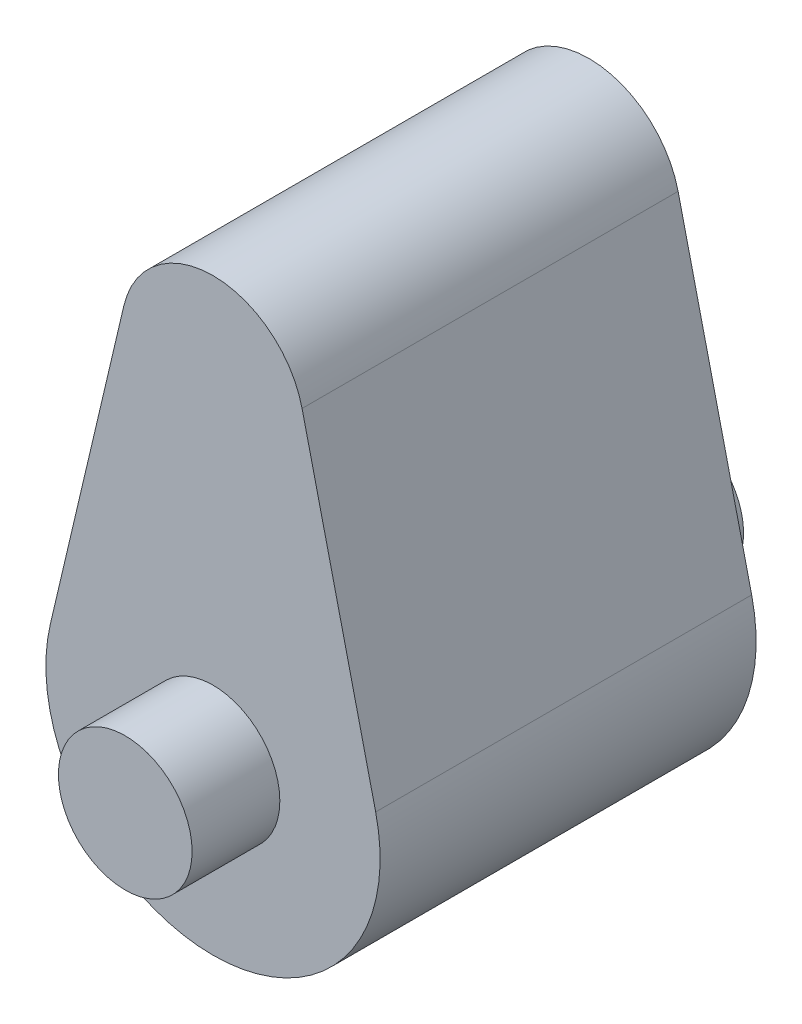
ISO-10303-21;
HEADER;
FILE_DESCRIPTION(('STEP AP214'),'2;1');
FILE_NAME('part.step','',(''),(''),'','','');
FILE_SCHEMA(('AUTOMOTIVE_DESIGN { 1 0 10303 214 1 1 1 1 }'));
ENDSEC;
DATA;
#1=APPLICATION_CONTEXT('core data for automotive mechanical design processes');
#2=APPLICATION_PROTOCOL_DEFINITION('international standard','automotive_design',2000,#1);
#3=PRODUCT_CONTEXT('',#1,'mechanical');
#4=PRODUCT('Part','Part','',(#3));
#5=PRODUCT_RELATED_PRODUCT_CATEGORY('part','',(#4));
#6=PRODUCT_DEFINITION_FORMATION('','',#4);
#7=PRODUCT_DEFINITION_CONTEXT('part definition',#1,'design');
#8=PRODUCT_DEFINITION('design','',#6,#7);
#9=PRODUCT_DEFINITION_SHAPE('','',#8);
#10=(LENGTH_UNIT() NAMED_UNIT(*) SI_UNIT(.MILLI.,.METRE.));
#11=(NAMED_UNIT(*) PLANE_ANGLE_UNIT() SI_UNIT($,.RADIAN.));
#12=(NAMED_UNIT(*) SI_UNIT($,.STERADIAN.) SOLID_ANGLE_UNIT());
#13=UNCERTAINTY_MEASURE_WITH_UNIT(LENGTH_MEASURE(1.E-05),#10,'distance_accuracy_value','');
#14=(GEOMETRIC_REPRESENTATION_CONTEXT(3) GLOBAL_UNCERTAINTY_ASSIGNED_CONTEXT((#13)) GLOBAL_UNIT_ASSIGNED_CONTEXT((#10,
#11,#12)) REPRESENTATION_CONTEXT('',''));
#15=CARTESIAN_POINT('',(0.,0.,0.));
#16=DIRECTION('',(0.,0.,1.));
#17=DIRECTION('',(1.,0.,0.));
#18=AXIS2_PLACEMENT_3D('',#15,#16,#17);
#19=CARTESIAN_POINT('',(0.,0.,66.));
#20=DIRECTION('',(0.,0.,-1.));
#21=DIRECTION('',(-1.,0.,0.));
#22=AXIS2_PLACEMENT_3D('',#19,#20,#21);
#23=CYLINDRICAL_SURFACE('',#22,8.);
#24=CARTESIAN_POINT('',(0.,0.,55.5));
#25=DIRECTION('',(0.,0.,1.));
#26=DIRECTION('',(1.,0.,0.));
#27=AXIS2_PLACEMENT_3D('',#24,#25,#26);
#28=CIRCLE('',#27,8.);
#29=CARTESIAN_POINT('',(8.,0.,55.5));
#30=VERTEX_POINT('',#29);
#31=EDGE_CURVE('E36',#30,#30,#28,.T.);
#32=ORIENTED_EDGE('',*,*,#31,.T.);
#33=EDGE_LOOP('',(#32));
#34=FACE_BOUND('',#33,.T.);
#35=CARTESIAN_POINT('',(0.,0.,66.));
#36=DIRECTION('',(0.,0.,1.));
#37=DIRECTION('',(1.,0.,0.));
#38=AXIS2_PLACEMENT_3D('',#35,#36,#37);
#39=CIRCLE('',#38,8.);
#40=CARTESIAN_POINT('',(8.,0.,66.));
#41=VERTEX_POINT('',#40);
#42=EDGE_CURVE('E42',#41,#41,#39,.T.);
#43=ORIENTED_EDGE('',*,*,#42,.F.);
#44=EDGE_LOOP('',(#43));
#45=FACE_BOUND('',#44,.T.);
#46=ADVANCED_FACE('F33',(#34,#45),#23,.T.);
#47=CARTESIAN_POINT('',(0.,0.,66.));
#48=DIRECTION('',(0.,0.,1.));
#49=DIRECTION('',(1.,0.,0.));
#50=AXIS2_PLACEMENT_3D('',#47,#48,#49);
#51=PLANE('',#50);
#52=ORIENTED_EDGE('',*,*,#42,.T.);
#53=EDGE_LOOP('',(#52));
#54=FACE_BOUND('',#53,.T.);
#55=ADVANCED_FACE('F134',(#54),#51,.T.);
#56=CARTESIAN_POINT('',(0.,39.4931817263597,55.5));
#57=DIRECTION('',(0.,0.,-1.));
#58=DIRECTION('',(-1.,0.,0.));
#59=AXIS2_PLACEMENT_3D('',#56,#57,#58);
#60=CYLINDRICAL_SURFACE('',#59,10.9534248239518);
#61=CARTESIAN_POINT('',(0.,39.4931817263597,10.5));
#62=DIRECTION('',(0.,0.,1.));
#63=DIRECTION('',(1.,0.,0.));
#64=AXIS2_PLACEMENT_3D('',#61,#62,#63);
#65=CIRCLE('',#64,10.9534248239518);
#66=CARTESIAN_POINT('',(10.6621810863964,42.0022472605487,10.5));
#67=VERTEX_POINT('',#66);
#68=CARTESIAN_POINT('',(-10.6621810863964,42.0022472605487,10.5));
#69=VERTEX_POINT('',#68);
#70=EDGE_CURVE('E101',#67,#69,#65,.T.);
#71=ORIENTED_EDGE('',*,*,#70,.T.);
#72=DIRECTION('',(0.,0.,-1.));
#73=VECTOR('',#72,1.);
#74=CARTESIAN_POINT('',(-10.6621810863964,42.0022472605487,55.5));
#75=LINE('',#74,#73);
#76=CARTESIAN_POINT('',(-10.6621810863964,42.0022472605487,55.5));
#77=VERTEX_POINT('',#76);
#78=EDGE_CURVE('E92',#77,#69,#75,.T.);
#79=ORIENTED_EDGE('',*,*,#78,.F.);
#80=CARTESIAN_POINT('',(0.,39.4931817263597,55.5));
#81=DIRECTION('',(0.,0.,1.));
#82=DIRECTION('',(1.,0.,0.));
#83=AXIS2_PLACEMENT_3D('',#80,#81,#82);
#84=CIRCLE('',#83,10.9534248239518);
#85=CARTESIAN_POINT('',(10.6621810863964,42.0022472605487,55.5));
#86=VERTEX_POINT('',#85);
#87=EDGE_CURVE('E86',#86,#77,#84,.T.);
#88=ORIENTED_EDGE('',*,*,#87,.F.);
#89=DIRECTION('',(0.,0.,-1.));
#90=VECTOR('',#89,1.);
#91=CARTESIAN_POINT('',(10.6621810863964,42.0022472605487,55.5));
#92=LINE('',#91,#90);
#93=EDGE_CURVE('E97',#86,#67,#92,.T.);
#94=ORIENTED_EDGE('',*,*,#93,.T.);
#95=EDGE_LOOP('',(#71,#79,#88,#94));
#96=FACE_BOUND('',#95,.T.);
#97=ADVANCED_FACE('F141',(#96),#60,.T.);
#98=CARTESIAN_POINT('',(-10.6621810863964,42.0022472605487,55.5));
#99=DIRECTION('',(0.973410714709195,-0.229066759896178,0.));
#100=DIRECTION('',(0.229066759896178,0.973410714709196,0.));
#101=AXIS2_PLACEMENT_3D('',#98,#99,#100);
#102=PLANE('',#101);
#103=DIRECTION('',(-0.229066759896178,-0.973410714709196,0.));
#104=VECTOR('',#103,1.);
#105=CARTESIAN_POINT('',(-10.6621810863964,42.0022472605487,10.5));
#106=LINE('',#105,#104);
#107=CARTESIAN_POINT('',(-19.4682142941839,4.58133519792355,10.5));
#108=VERTEX_POINT('',#107);
#109=EDGE_CURVE('E91',#69,#108,#106,.T.);
#110=ORIENTED_EDGE('',*,*,#109,.T.);
#111=DIRECTION('',(0.,0.,-1.));
#112=VECTOR('',#111,1.);
#113=CARTESIAN_POINT('',(-19.4682142941839,4.58133519792355,55.5));
#114=LINE('',#113,#112);
#115=CARTESIAN_POINT('',(-19.4682142941839,4.58133519792355,55.5));
#116=VERTEX_POINT('',#115);
#117=EDGE_CURVE('E89',#116,#108,#114,.T.);
#118=ORIENTED_EDGE('',*,*,#117,.F.);
#119=DIRECTION('',(-0.229066759896178,-0.973410714709196,0.));
#120=VECTOR('',#119,1.);
#121=CARTESIAN_POINT('',(-10.6621810863964,42.0022472605487,55.5));
#122=LINE('',#121,#120);
#123=EDGE_CURVE('E81',#77,#116,#122,.T.);
#124=ORIENTED_EDGE('',*,*,#123,.F.);
#125=ORIENTED_EDGE('',*,*,#78,.T.);
#126=EDGE_LOOP('',(#110,#118,#124,#125));
#127=FACE_BOUND('',#126,.T.);
#128=ADVANCED_FACE('F90',(#127),#102,.F.);
#129=CARTESIAN_POINT('',(0.,0.,55.5));
#130=DIRECTION('',(0.,0.,-1.));
#131=DIRECTION('',(-1.,0.,0.));
#132=AXIS2_PLACEMENT_3D('',#129,#130,#131);
#133=CYLINDRICAL_SURFACE('',#132,20.);
#134=CARTESIAN_POINT('',(0.,0.,10.5));
#135=DIRECTION('',(0.,0.,1.));
#136=DIRECTION('',(1.,0.,0.));
#137=AXIS2_PLACEMENT_3D('',#134,#135,#136);
#138=CIRCLE('',#137,20.);
#139=CARTESIAN_POINT('',(19.4682142941839,4.58133519792355,10.5));
#140=VERTEX_POINT('',#139);
#141=EDGE_CURVE('E67',#108,#140,#138,.T.);
#142=ORIENTED_EDGE('',*,*,#141,.T.);
#143=DIRECTION('',(0.,0.,-1.));
#144=VECTOR('',#143,1.);
#145=CARTESIAN_POINT('',(19.4682142941839,4.58133519792355,55.5));
#146=LINE('',#145,#144);
#147=CARTESIAN_POINT('',(19.4682142941839,4.58133519792355,55.5));
#148=VERTEX_POINT('',#147);
#149=EDGE_CURVE('E93',#148,#140,#146,.T.);
#150=ORIENTED_EDGE('',*,*,#149,.F.);
#151=CARTESIAN_POINT('',(0.,0.,55.5));
#152=DIRECTION('',(0.,0.,1.));
#153=DIRECTION('',(1.,0.,0.));
#154=AXIS2_PLACEMENT_3D('',#151,#152,#153);
#155=CIRCLE('',#154,20.);
#156=EDGE_CURVE('E84',#116,#148,#155,.T.);
#157=ORIENTED_EDGE('',*,*,#156,.F.);
#158=ORIENTED_EDGE('',*,*,#117,.T.);
#159=EDGE_LOOP('',(#142,#150,#157,#158));
#160=FACE_BOUND('',#159,.T.);
#161=ADVANCED_FACE('F95',(#160),#133,.T.);
#162=CARTESIAN_POINT('',(10.6621810863964,42.0022472605487,55.5));
#163=DIRECTION('',(-0.973410714709195,-0.229066759896178,0.));
#164=DIRECTION('',(0.229066759896178,-0.973410714709196,0.));
#165=AXIS2_PLACEMENT_3D('',#162,#163,#164);
#166=PLANE('',#165);
#167=DIRECTION('',(-0.229066759896178,0.973410714709196,0.));
#168=VECTOR('',#167,1.);
#169=CARTESIAN_POINT('',(10.6621810863964,42.0022472605487,10.5));
#170=LINE('',#169,#168);
#171=EDGE_CURVE('E73',#140,#67,#170,.T.);
#172=ORIENTED_EDGE('',*,*,#171,.T.);
#173=ORIENTED_EDGE('',*,*,#93,.F.);
#174=DIRECTION('',(-0.229066759896178,0.973410714709196,0.));
#175=VECTOR('',#174,1.);
#176=CARTESIAN_POINT('',(10.6621810863964,42.0022472605487,55.5));
#177=LINE('',#176,#175);
#178=EDGE_CURVE('E50',#148,#86,#177,.T.);
#179=ORIENTED_EDGE('',*,*,#178,.F.);
#180=ORIENTED_EDGE('',*,*,#149,.T.);
#181=EDGE_LOOP('',(#172,#173,#179,#180));
#182=FACE_BOUND('',#181,.T.);
#183=ADVANCED_FACE('F123',(#182),#166,.F.);
#184=CARTESIAN_POINT('',(0.,39.4931817263597,55.5));
#185=DIRECTION('',(0.,0.,1.));
#186=DIRECTION('',(1.,0.,0.));
#187=AXIS2_PLACEMENT_3D('',#184,#185,#186);
#188=PLANE('',#187);
#189=ORIENTED_EDGE('',*,*,#31,.F.);
#190=EDGE_LOOP('',(#189));
#191=FACE_BOUND('',#190,.T.);
#192=ORIENTED_EDGE('',*,*,#87,.T.);
#193=ORIENTED_EDGE('',*,*,#123,.T.);
#194=ORIENTED_EDGE('',*,*,#156,.T.);
#195=ORIENTED_EDGE('',*,*,#178,.T.);
#196=EDGE_LOOP('',(#192,#193,#194,#195));
#197=FACE_BOUND('',#196,.T.);
#198=ADVANCED_FACE('F82',(#191,#197),#188,.T.);
#199=CARTESIAN_POINT('',(0.,39.4931817263597,10.5));
#200=DIRECTION('',(0.,0.,1.));
#201=DIRECTION('',(1.,0.,0.));
#202=AXIS2_PLACEMENT_3D('',#199,#200,#201);
#203=PLANE('',#202);
#204=CARTESIAN_POINT('',(0.,0.,10.5));
#205=DIRECTION('',(0.,0.,1.));
#206=DIRECTION('',(1.,0.,0.));
#207=AXIS2_PLACEMENT_3D('',#204,#205,#206);
#208=CIRCLE('',#207,8.);
#209=CARTESIAN_POINT('',(8.,0.,10.5));
#210=VERTEX_POINT('',#209);
#211=EDGE_CURVE('E11',#210,#210,#208,.T.);
#212=ORIENTED_EDGE('',*,*,#211,.T.);
#213=EDGE_LOOP('',(#212));
#214=FACE_BOUND('',#213,.T.);
#215=ORIENTED_EDGE('',*,*,#70,.F.);
#216=ORIENTED_EDGE('',*,*,#171,.F.);
#217=ORIENTED_EDGE('',*,*,#141,.F.);
#218=ORIENTED_EDGE('',*,*,#109,.F.);
#219=EDGE_LOOP('',(#215,#216,#217,#218));
#220=FACE_BOUND('',#219,.T.);
#221=ADVANCED_FACE('F122',(#214,#220),#203,.F.);
#222=CARTESIAN_POINT('',(0.,0.,0.));
#223=DIRECTION('',(0.,0.,1.));
#224=DIRECTION('',(1.,0.,0.));
#225=AXIS2_PLACEMENT_3D('',#222,#223,#224);
#226=PLANE('',#225);
#227=CARTESIAN_POINT('',(0.,0.,0.));
#228=DIRECTION('',(0.,0.,1.));
#229=DIRECTION('',(1.,0.,0.));
#230=AXIS2_PLACEMENT_3D('',#227,#228,#229);
#231=CIRCLE('',#230,8.);
#232=CARTESIAN_POINT('',(8.,0.,0.));
#233=VERTEX_POINT('',#232);
#234=EDGE_CURVE('E112',#233,#233,#231,.T.);
#235=ORIENTED_EDGE('',*,*,#234,.F.);
#236=EDGE_LOOP('',(#235));
#237=FACE_BOUND('',#236,.T.);
#238=ADVANCED_FACE('F129',(#237),#226,.F.);
#239=ORIENTED_EDGE('',*,*,#234,.T.);
#240=EDGE_LOOP('',(#239));
#241=FACE_BOUND('',#240,.T.);
#242=ORIENTED_EDGE('',*,*,#211,.F.);
#243=EDGE_LOOP('',(#242));
#244=FACE_BOUND('',#243,.T.);
#245=ADVANCED_FACE('F135',(#241,#244),#23,.T.);
#246=CLOSED_SHELL('',(#46,#55,#97,#128,#161,#183,#198,#221,#238,#245));
#247=MANIFOLD_SOLID_BREP('B2',#246);
#248=ADVANCED_BREP_SHAPE_REPRESENTATION('',(#18,#247),#14);
#249=SHAPE_DEFINITION_REPRESENTATION(#9,#248);
ENDSEC;
END-ISO-10303-21;
